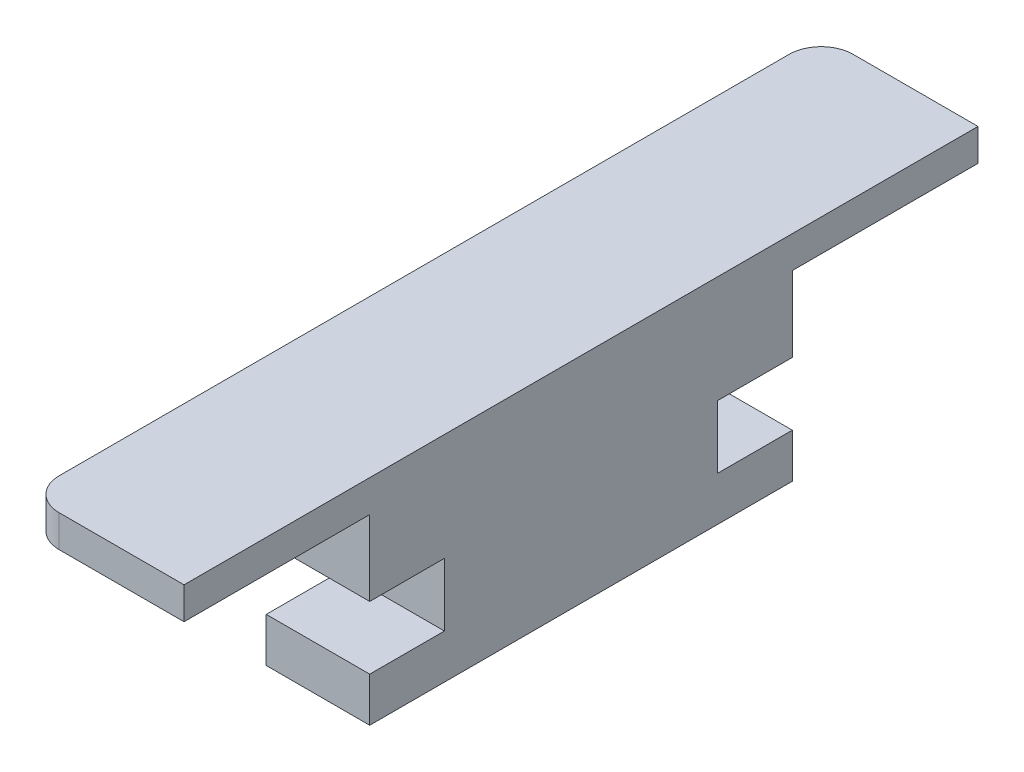
ISO-10303-21;
HEADER;
FILE_DESCRIPTION(('STEP AP214'),'2;1');
FILE_NAME('part.step','',(''),(''),'','','');
FILE_SCHEMA(('AUTOMOTIVE_DESIGN { 1 0 10303 214 1 1 1 1 }'));
ENDSEC;
DATA;
#1=APPLICATION_CONTEXT('core data for automotive mechanical design processes');
#2=APPLICATION_PROTOCOL_DEFINITION('international standard','automotive_design',2000,#1);
#3=PRODUCT_CONTEXT('',#1,'mechanical');
#4=PRODUCT('Part','Part','',(#3));
#5=PRODUCT_RELATED_PRODUCT_CATEGORY('part','',(#4));
#6=PRODUCT_DEFINITION_FORMATION('','',#4);
#7=PRODUCT_DEFINITION_CONTEXT('part definition',#1,'design');
#8=PRODUCT_DEFINITION('design','',#6,#7);
#9=PRODUCT_DEFINITION_SHAPE('','',#8);
#10=(LENGTH_UNIT() NAMED_UNIT(*) SI_UNIT(.MILLI.,.METRE.));
#11=(NAMED_UNIT(*) PLANE_ANGLE_UNIT() SI_UNIT($,.RADIAN.));
#12=(NAMED_UNIT(*) SI_UNIT($,.STERADIAN.) SOLID_ANGLE_UNIT());
#13=UNCERTAINTY_MEASURE_WITH_UNIT(LENGTH_MEASURE(1.E-05),#10,'distance_accuracy_value','');
#14=(GEOMETRIC_REPRESENTATION_CONTEXT(3) GLOBAL_UNCERTAINTY_ASSIGNED_CONTEXT((#13)) GLOBAL_UNIT_ASSIGNED_CONTEXT((#10,
#11,#12)) REPRESENTATION_CONTEXT('',''));
#15=CARTESIAN_POINT('',(0.,0.,0.));
#16=DIRECTION('',(0.,0.,1.));
#17=DIRECTION('',(1.,0.,0.));
#18=AXIS2_PLACEMENT_3D('',#15,#16,#17);
#19=CARTESIAN_POINT('',(10.7056774565792,15.3,0.));
#20=DIRECTION('',(-1.,0.,0.));
#21=DIRECTION('',(0.,0.,1.));
#22=AXIS2_PLACEMENT_3D('',#19,#20,#21);
#23=PLANE('',#22);
#24=DIRECTION('',(0.,0.,1.));
#25=VECTOR('',#24,1.);
#26=CARTESIAN_POINT('',(10.7056774565792,0.200000000000001,0.));
#27=LINE('',#26,#25);
#28=CARTESIAN_POINT('',(10.7056774565792,0.2,-32.884960149613));
#29=VERTEX_POINT('',#28);
#30=CARTESIAN_POINT('',(10.7056774565792,0.2,6.71503985038701));
#31=VERTEX_POINT('',#30);
#32=EDGE_CURVE('E236',#29,#31,#27,.T.);
#33=ORIENTED_EDGE('',*,*,#32,.F.);
#34=DIRECTION('',(0.,-1.,0.));
#35=VECTOR('',#34,1.);
#36=CARTESIAN_POINT('',(10.7056774565792,15.3,-32.884960149613));
#37=LINE('',#36,#35);
#38=CARTESIAN_POINT('',(10.7056774565792,4.35,-32.884960149613));
#39=VERTEX_POINT('',#38);
#40=EDGE_CURVE('E215',#39,#29,#37,.T.);
#41=ORIENTED_EDGE('',*,*,#40,.F.);
#42=DIRECTION('',(0.,0.,-1.));
#43=VECTOR('',#42,1.);
#44=CARTESIAN_POINT('',(10.7056774565792,4.35,-26.169920299226));
#45=LINE('',#44,#43);
#46=CARTESIAN_POINT('',(10.7056774565792,4.35,-25.884960149613));
#47=VERTEX_POINT('',#46);
#48=EDGE_CURVE('E201',#47,#39,#45,.T.);
#49=ORIENTED_EDGE('',*,*,#48,.F.);
#50=DIRECTION('',(0.,-1.,0.));
#51=VECTOR('',#50,1.);
#52=CARTESIAN_POINT('',(10.7056774565792,15.3,-25.884960149613));
#53=LINE('',#52,#51);
#54=CARTESIAN_POINT('',(10.7056774565792,10.25,-25.884960149613));
#55=VERTEX_POINT('',#54);
#56=EDGE_CURVE('E212',#55,#47,#53,.T.);
#57=ORIENTED_EDGE('',*,*,#56,.F.);
#58=DIRECTION('',(0.,0.,1.));
#59=VECTOR('',#58,1.);
#60=CARTESIAN_POINT('',(10.7056774565792,10.25,-26.169920299226));
#61=LINE('',#60,#59);
#62=CARTESIAN_POINT('',(10.7056774565792,10.25,-32.884960149613));
#63=VERTEX_POINT('',#62);
#64=EDGE_CURVE('E209',#63,#55,#61,.T.);
#65=ORIENTED_EDGE('',*,*,#64,.F.);
#66=CARTESIAN_POINT('',(10.7056774565792,17.3,-32.884960149613));
#67=VERTEX_POINT('',#66);
#68=EDGE_CURVE('E216',#67,#63,#37,.T.);
#69=ORIENTED_EDGE('',*,*,#68,.F.);
#70=DIRECTION('',(0.,0.,-1.));
#71=VECTOR('',#70,1.);
#72=CARTESIAN_POINT('',(10.7056774565792,17.3,24.115039850387));
#73=LINE('',#72,#71);
#74=CARTESIAN_POINT('',(10.7056774565792,17.3,-50.284960149613));
#75=VERTEX_POINT('',#74);
#76=EDGE_CURVE('E54',#67,#75,#73,.T.);
#77=ORIENTED_EDGE('',*,*,#76,.T.);
#78=DIRECTION('',(0.,-1.,0.));
#79=VECTOR('',#78,1.);
#80=CARTESIAN_POINT('',(10.7056774565792,0.,-50.284960149613));
#81=LINE('',#80,#79);
#82=CARTESIAN_POINT('',(10.7056774565792,20.3,-50.284960149613));
#83=VERTEX_POINT('',#82);
#84=EDGE_CURVE('E11',#83,#75,#81,.T.);
#85=ORIENTED_EDGE('',*,*,#84,.F.);
#86=DIRECTION('',(0.,0.,1.));
#87=VECTOR('',#86,1.);
#88=CARTESIAN_POINT('',(10.7056774565792,20.3,24.115039850387));
#89=LINE('',#88,#87);
#90=CARTESIAN_POINT('',(10.7056774565792,20.3,24.115039850387));
#91=VERTEX_POINT('',#90);
#92=EDGE_CURVE('E162',#83,#91,#89,.T.);
#93=ORIENTED_EDGE('',*,*,#92,.T.);
#94=DIRECTION('',(0.,1.,0.));
#95=VECTOR('',#94,1.);
#96=CARTESIAN_POINT('',(10.7056774565792,0.,24.115039850387));
#97=LINE('',#96,#95);
#98=CARTESIAN_POINT('',(10.7056774565792,17.3,24.115039850387));
#99=VERTEX_POINT('',#98);
#100=EDGE_CURVE('E305',#99,#91,#97,.T.);
#101=ORIENTED_EDGE('',*,*,#100,.F.);
#102=CARTESIAN_POINT('',(10.7056774565792,17.3,6.71503985038701));
#103=VERTEX_POINT('',#102);
#104=EDGE_CURVE('E307',#99,#103,#73,.T.);
#105=ORIENTED_EDGE('',*,*,#104,.T.);
#106=DIRECTION('',(0.,-1.,0.));
#107=VECTOR('',#106,1.);
#108=CARTESIAN_POINT('',(10.7056774565792,15.3,6.71503985038701));
#109=LINE('',#108,#107);
#110=CARTESIAN_POINT('',(10.7056774565792,10.25,6.71503985038701));
#111=VERTEX_POINT('',#110);
#112=EDGE_CURVE('E280',#103,#111,#109,.T.);
#113=ORIENTED_EDGE('',*,*,#112,.T.);
#114=DIRECTION('',(0.,0.,-1.));
#115=VECTOR('',#114,1.);
#116=CARTESIAN_POINT('',(10.7056774565792,10.25,0.));
#117=LINE('',#116,#115);
#118=CARTESIAN_POINT('',(10.7056774565792,10.25,-0.284960149612992));
#119=VERTEX_POINT('',#118);
#120=EDGE_CURVE('E273',#111,#119,#117,.T.);
#121=ORIENTED_EDGE('',*,*,#120,.T.);
#122=DIRECTION('',(0.,-1.,0.));
#123=VECTOR('',#122,1.);
#124=CARTESIAN_POINT('',(10.7056774565792,15.3,-0.284960149612992));
#125=LINE('',#124,#123);
#126=CARTESIAN_POINT('',(10.7056774565792,4.35,-0.284960149612992));
#127=VERTEX_POINT('',#126);
#128=EDGE_CURVE('E276',#119,#127,#125,.T.);
#129=ORIENTED_EDGE('',*,*,#128,.T.);
#130=DIRECTION('',(0.,0.,1.));
#131=VECTOR('',#130,1.);
#132=CARTESIAN_POINT('',(10.7056774565792,4.35,0.));
#133=LINE('',#132,#131);
#134=CARTESIAN_POINT('',(10.7056774565792,4.35,6.71503985038701));
#135=VERTEX_POINT('',#134);
#136=EDGE_CURVE('E263',#127,#135,#133,.T.);
#137=ORIENTED_EDGE('',*,*,#136,.T.);
#138=EDGE_CURVE('E279',#135,#31,#109,.T.);
#139=ORIENTED_EDGE('',*,*,#138,.T.);
#140=EDGE_LOOP('',(#33,#41,#49,#57,#65,#69,#77,#85,#93,#101,#105,#113,#121,#129,#137,#139));
#141=FACE_BOUND('',#140,.T.);
#142=ADVANCED_FACE('F39',(#141),#23,.F.);
#143=CARTESIAN_POINT('',(1.00567745657921,15.3,0.));
#144=DIRECTION('',(-1.,0.,0.));
#145=DIRECTION('',(0.,0.,1.));
#146=AXIS2_PLACEMENT_3D('',#143,#144,#145);
#147=PLANE('',#146);
#148=DIRECTION('',(0.,0.,1.));
#149=VECTOR('',#148,1.);
#150=CARTESIAN_POINT('',(1.00567745657921,17.3,24.115039850387));
#151=LINE('',#150,#149);
#152=CARTESIAN_POINT('',(1.00567745657921,17.3,-32.884960149613));
#153=VERTEX_POINT('',#152);
#154=CARTESIAN_POINT('',(1.00567745657921,17.3,6.71503985038701));
#155=VERTEX_POINT('',#154);
#156=EDGE_CURVE('E238',#153,#155,#151,.T.);
#157=ORIENTED_EDGE('',*,*,#156,.F.);
#158=DIRECTION('',(0.,-1.,0.));
#159=VECTOR('',#158,1.);
#160=CARTESIAN_POINT('',(1.00567745657921,15.3,-32.884960149613));
#161=LINE('',#160,#159);
#162=CARTESIAN_POINT('',(1.0056774565792,10.25,-32.884960149613));
#163=VERTEX_POINT('',#162);
#164=EDGE_CURVE('E220',#153,#163,#161,.T.);
#165=ORIENTED_EDGE('',*,*,#164,.T.);
#166=DIRECTION('',(0.,0.,-1.));
#167=VECTOR('',#166,1.);
#168=CARTESIAN_POINT('',(1.0056774565792,10.25,-25.884960149613));
#169=LINE('',#168,#167);
#170=CARTESIAN_POINT('',(1.0056774565792,10.25,-25.884960149613));
#171=VERTEX_POINT('',#170);
#172=EDGE_CURVE('E195',#171,#163,#169,.T.);
#173=ORIENTED_EDGE('',*,*,#172,.F.);
#174=DIRECTION('',(0.,1.,0.));
#175=VECTOR('',#174,1.);
#176=CARTESIAN_POINT('',(1.0056774565792,4.35,-25.884960149613));
#177=LINE('',#176,#175);
#178=CARTESIAN_POINT('',(1.0056774565792,4.35,-25.884960149613));
#179=VERTEX_POINT('',#178);
#180=EDGE_CURVE('E192',#179,#171,#177,.T.);
#181=ORIENTED_EDGE('',*,*,#180,.F.);
#182=DIRECTION('',(0.,0.,1.));
#183=VECTOR('',#182,1.);
#184=CARTESIAN_POINT('',(1.0056774565792,4.35,-32.884960149613));
#185=LINE('',#184,#183);
#186=CARTESIAN_POINT('',(1.00567745657921,4.35,-32.884960149613));
#187=VERTEX_POINT('',#186);
#188=EDGE_CURVE('E184',#187,#179,#185,.T.);
#189=ORIENTED_EDGE('',*,*,#188,.F.);
#190=CARTESIAN_POINT('',(1.00567745657921,0.2,-32.884960149613));
#191=VERTEX_POINT('',#190);
#192=EDGE_CURVE('E219',#187,#191,#161,.T.);
#193=ORIENTED_EDGE('',*,*,#192,.T.);
#194=DIRECTION('',(0.,0.,-1.));
#195=VECTOR('',#194,1.);
#196=CARTESIAN_POINT('',(1.00567745657921,0.2,6.71503985038701));
#197=LINE('',#196,#195);
#198=CARTESIAN_POINT('',(1.00567745657921,0.2,6.71503985038701));
#199=VERTEX_POINT('',#198);
#200=EDGE_CURVE('E232',#199,#191,#197,.T.);
#201=ORIENTED_EDGE('',*,*,#200,.F.);
#202=DIRECTION('',(0.,-1.,0.));
#203=VECTOR('',#202,1.);
#204=CARTESIAN_POINT('',(1.00567745657921,15.3,6.71503985038701));
#205=LINE('',#204,#203);
#206=CARTESIAN_POINT('',(1.00567745657921,4.35,6.71503985038701));
#207=VERTEX_POINT('',#206);
#208=EDGE_CURVE('E283',#207,#199,#205,.T.);
#209=ORIENTED_EDGE('',*,*,#208,.F.);
#210=DIRECTION('',(0.,0.,-1.));
#211=VECTOR('',#210,1.);
#212=CARTESIAN_POINT('',(1.0056774565792,4.35,6.71503985038701));
#213=LINE('',#212,#211);
#214=CARTESIAN_POINT('',(1.0056774565792,4.35,-0.284960149612992));
#215=VERTEX_POINT('',#214);
#216=EDGE_CURVE('E250',#207,#215,#213,.T.);
#217=ORIENTED_EDGE('',*,*,#216,.T.);
#218=DIRECTION('',(0.,1.,0.));
#219=VECTOR('',#218,1.);
#220=CARTESIAN_POINT('',(1.0056774565792,4.35,-0.284960149612992));
#221=LINE('',#220,#219);
#222=CARTESIAN_POINT('',(1.0056774565792,10.25,-0.284960149612992));
#223=VERTEX_POINT('',#222);
#224=EDGE_CURVE('E253',#215,#223,#221,.T.);
#225=ORIENTED_EDGE('',*,*,#224,.T.);
#226=DIRECTION('',(0.,0.,1.));
#227=VECTOR('',#226,1.);
#228=CARTESIAN_POINT('',(1.0056774565792,10.25,-0.284960149612992));
#229=LINE('',#228,#227);
#230=CARTESIAN_POINT('',(1.0056774565792,10.25,6.71503985038701));
#231=VERTEX_POINT('',#230);
#232=EDGE_CURVE('E256',#223,#231,#229,.T.);
#233=ORIENTED_EDGE('',*,*,#232,.T.);
#234=EDGE_CURVE('E284',#155,#231,#205,.T.);
#235=ORIENTED_EDGE('',*,*,#234,.F.);
#236=EDGE_LOOP('',(#157,#165,#173,#181,#189,#193,#201,#209,#217,#225,#233,#235));
#237=FACE_BOUND('',#236,.T.);
#238=ADVANCED_FACE('F322',(#237),#147,.T.);
#239=CARTESIAN_POINT('',(0.,15.3,6.71503985038701));
#240=DIRECTION('',(0.,0.,-1.));
#241=DIRECTION('',(-1.,0.,0.));
#242=AXIS2_PLACEMENT_3D('',#239,#240,#241);
#243=PLANE('',#242);
#244=DIRECTION('',(-1.,0.,0.));
#245=VECTOR('',#244,1.);
#246=CARTESIAN_POINT('',(1.00567745657921,0.2,6.71503985038701));
#247=LINE('',#246,#245);
#248=EDGE_CURVE('E234',#31,#199,#247,.T.);
#249=ORIENTED_EDGE('',*,*,#248,.F.);
#250=ORIENTED_EDGE('',*,*,#138,.F.);
#251=DIRECTION('',(1.,0.,0.));
#252=VECTOR('',#251,1.);
#253=CARTESIAN_POINT('',(1.0056774565792,4.35,6.71503985038701));
#254=LINE('',#253,#252);
#255=EDGE_CURVE('E259',#207,#135,#254,.T.);
#256=ORIENTED_EDGE('',*,*,#255,.F.);
#257=ORIENTED_EDGE('',*,*,#208,.T.);
#258=EDGE_LOOP('',(#249,#250,#256,#257));
#259=FACE_BOUND('',#258,.T.);
#260=ADVANCED_FACE('F336',(#259),#243,.F.);
#261=ORIENTED_EDGE('',*,*,#112,.F.);
#262=DIRECTION('',(1.,0.,0.));
#263=VECTOR('',#262,1.);
#264=CARTESIAN_POINT('',(1.00567745657921,17.3,6.71503985038701));
#265=LINE('',#264,#263);
#266=EDGE_CURVE('E247',#155,#103,#265,.T.);
#267=ORIENTED_EDGE('',*,*,#266,.F.);
#268=ORIENTED_EDGE('',*,*,#234,.T.);
#269=DIRECTION('',(1.,0.,0.));
#270=VECTOR('',#269,1.);
#271=CARTESIAN_POINT('',(1.0056774565792,10.25,6.71503985038701));
#272=LINE('',#271,#270);
#273=EDGE_CURVE('E260',#231,#111,#272,.T.);
#274=ORIENTED_EDGE('',*,*,#273,.T.);
#275=EDGE_LOOP('',(#261,#267,#268,#274));
#276=FACE_BOUND('',#275,.T.);
#277=ADVANCED_FACE('F349',(#276),#243,.F.);
#278=CARTESIAN_POINT('',(1.0056774565792,4.35,6.71503985038701));
#279=DIRECTION('',(0.,-1.,0.));
#280=DIRECTION('',(0.,0.,-1.));
#281=AXIS2_PLACEMENT_3D('',#278,#279,#280);
#282=PLANE('',#281);
#283=DIRECTION('',(1.,0.,0.));
#284=VECTOR('',#283,1.);
#285=CARTESIAN_POINT('',(1.0056774565792,4.35,-0.284960149612992));
#286=LINE('',#285,#284);
#287=EDGE_CURVE('E267',#215,#127,#286,.T.);
#288=ORIENTED_EDGE('',*,*,#287,.F.);
#289=ORIENTED_EDGE('',*,*,#216,.F.);
#290=ORIENTED_EDGE('',*,*,#255,.T.);
#291=ORIENTED_EDGE('',*,*,#136,.F.);
#292=EDGE_LOOP('',(#288,#289,#290,#291));
#293=FACE_BOUND('',#292,.T.);
#294=ADVANCED_FACE('F340',(#293),#282,.F.);
#295=CARTESIAN_POINT('',(1.0056774565792,10.25,-0.284960149612992));
#296=DIRECTION('',(0.,1.,0.));
#297=DIRECTION('',(0.,0.,1.));
#298=AXIS2_PLACEMENT_3D('',#295,#296,#297);
#299=PLANE('',#298);
#300=ORIENTED_EDGE('',*,*,#273,.F.);
#301=ORIENTED_EDGE('',*,*,#232,.F.);
#302=DIRECTION('',(1.,0.,0.));
#303=VECTOR('',#302,1.);
#304=CARTESIAN_POINT('',(1.0056774565792,10.25,-0.284960149612992));
#305=LINE('',#304,#303);
#306=EDGE_CURVE('E264',#223,#119,#305,.T.);
#307=ORIENTED_EDGE('',*,*,#306,.T.);
#308=ORIENTED_EDGE('',*,*,#120,.F.);
#309=EDGE_LOOP('',(#300,#301,#307,#308));
#310=FACE_BOUND('',#309,.T.);
#311=ADVANCED_FACE('F345',(#310),#299,.F.);
#312=CARTESIAN_POINT('',(1.0056774565792,4.35,-0.284960149612992));
#313=DIRECTION('',(0.,0.,-1.));
#314=DIRECTION('',(-1.,0.,0.));
#315=AXIS2_PLACEMENT_3D('',#312,#313,#314);
#316=PLANE('',#315);
#317=ORIENTED_EDGE('',*,*,#306,.F.);
#318=ORIENTED_EDGE('',*,*,#224,.F.);
#319=ORIENTED_EDGE('',*,*,#287,.T.);
#320=ORIENTED_EDGE('',*,*,#128,.F.);
#321=EDGE_LOOP('',(#317,#318,#319,#320));
#322=FACE_BOUND('',#321,.T.);
#323=ADVANCED_FACE('F342',(#322),#316,.F.);
#324=CARTESIAN_POINT('',(75.8056774565792,17.3,24.115039850387));
#325=DIRECTION('',(0.,-1.,0.));
#326=DIRECTION('',(0.,0.,-1.));
#327=AXIS2_PLACEMENT_3D('',#324,#325,#326);
#328=PLANE('',#327);
#329=ORIENTED_EDGE('',*,*,#104,.F.);
#330=DIRECTION('',(-1.,0.,0.));
#331=VECTOR('',#330,1.);
#332=CARTESIAN_POINT('',(75.8056774565792,17.3,24.115039850387));
#333=LINE('',#332,#331);
#334=CARTESIAN_POINT('',(-0.994322543420786,17.3,24.115039850387));
#335=VERTEX_POINT('',#334);
#336=EDGE_CURVE('E61',#99,#335,#333,.T.);
#337=ORIENTED_EDGE('',*,*,#336,.T.);
#338=CARTESIAN_POINT('',(-0.994322543420792,17.3,21.115039850387));
#339=DIRECTION('',(0.,-1.,0.));
#340=DIRECTION('',(0.,0.,-1.));
#341=AXIS2_PLACEMENT_3D('',#338,#339,#340);
#342=CIRCLE('',#341,3.);
#343=CARTESIAN_POINT('',(-3.99432254342079,17.3,21.115039850387));
#344=VERTEX_POINT('',#343);
#345=EDGE_CURVE('E47',#335,#344,#342,.T.);
#346=ORIENTED_EDGE('',*,*,#345,.T.);
#347=DIRECTION('',(0.,0.,1.));
#348=VECTOR('',#347,1.);
#349=CARTESIAN_POINT('',(-3.99432254342079,17.3,24.115039850387));
#350=LINE('',#349,#348);
#351=CARTESIAN_POINT('',(-3.99432254342079,17.3,-47.284960149613));
#352=VERTEX_POINT('',#351);
#353=EDGE_CURVE('E241',#352,#344,#350,.T.);
#354=ORIENTED_EDGE('',*,*,#353,.F.);
#355=CARTESIAN_POINT('',(-0.994322543420792,17.3,-47.284960149613));
#356=DIRECTION('',(0.,1.,0.));
#357=DIRECTION('',(0.,0.,1.));
#358=AXIS2_PLACEMENT_3D('',#355,#356,#357);
#359=CIRCLE('',#358,3.);
#360=CARTESIAN_POINT('',(-0.994322543420786,17.3,-50.284960149613));
#361=VERTEX_POINT('',#360);
#362=EDGE_CURVE('E229',#361,#352,#359,.T.);
#363=ORIENTED_EDGE('',*,*,#362,.F.);
#364=DIRECTION('',(-1.,0.,0.));
#365=VECTOR('',#364,1.);
#366=CARTESIAN_POINT('',(75.8056774565792,17.3,-50.284960149613));
#367=LINE('',#366,#365);
#368=EDGE_CURVE('E181',#75,#361,#367,.T.);
#369=ORIENTED_EDGE('',*,*,#368,.F.);
#370=ORIENTED_EDGE('',*,*,#76,.F.);
#371=DIRECTION('',(1.,0.,0.));
#372=VECTOR('',#371,1.);
#373=CARTESIAN_POINT('',(1.00567745657921,17.3,-32.884960149613));
#374=LINE('',#373,#372);
#375=EDGE_CURVE('E180',#153,#67,#374,.T.);
#376=ORIENTED_EDGE('',*,*,#375,.F.);
#377=ORIENTED_EDGE('',*,*,#156,.T.);
#378=ORIENTED_EDGE('',*,*,#266,.T.);
#379=EDGE_LOOP('',(#329,#337,#346,#354,#363,#369,#370,#376,#377,#378));
#380=FACE_BOUND('',#379,.T.);
#381=ADVANCED_FACE('F294',(#380),#328,.T.);
#382=CARTESIAN_POINT('',(1.00567745657921,20.3,24.115039850387));
#383=DIRECTION('',(0.,1.,0.));
#384=DIRECTION('',(-1.,0.,0.));
#385=AXIS2_PLACEMENT_3D('',#382,#383,#384);
#386=PLANE('',#385);
#387=ORIENTED_EDGE('',*,*,#92,.F.);
#388=DIRECTION('',(1.,0.,0.));
#389=VECTOR('',#388,1.);
#390=CARTESIAN_POINT('',(1.00567745657921,20.3,-50.284960149613));
#391=LINE('',#390,#389);
#392=CARTESIAN_POINT('',(-0.994322543420792,20.3,-50.284960149613));
#393=VERTEX_POINT('',#392);
#394=EDGE_CURVE('E172',#393,#83,#391,.T.);
#395=ORIENTED_EDGE('',*,*,#394,.F.);
#396=CARTESIAN_POINT('',(-0.994322543420792,20.3,-47.284960149613));
#397=DIRECTION('',(0.,-1.,0.));
#398=DIRECTION('',(-1.,0.,0.));
#399=AXIS2_PLACEMENT_3D('',#396,#397,#398);
#400=CIRCLE('',#399,3.);
#401=CARTESIAN_POINT('',(-3.99432254342079,20.3,-47.284960149613));
#402=VERTEX_POINT('',#401);
#403=EDGE_CURVE('E226',#402,#393,#400,.T.);
#404=ORIENTED_EDGE('',*,*,#403,.F.);
#405=DIRECTION('',(0.,0.,-1.));
#406=VECTOR('',#405,1.);
#407=CARTESIAN_POINT('',(-3.99432254342079,20.3,24.115039850387));
#408=LINE('',#407,#406);
#409=CARTESIAN_POINT('',(-3.99432254342079,20.3,21.115039850387));
#410=VERTEX_POINT('',#409);
#411=EDGE_CURVE('E239',#410,#402,#408,.T.);
#412=ORIENTED_EDGE('',*,*,#411,.F.);
#413=CARTESIAN_POINT('',(-0.994322543420792,20.3,21.115039850387));
#414=DIRECTION('',(0.,1.,0.));
#415=DIRECTION('',(-1.,0.,0.));
#416=AXIS2_PLACEMENT_3D('',#413,#414,#415);
#417=CIRCLE('',#416,3.);
#418=CARTESIAN_POINT('',(-0.994322543420792,20.3,24.115039850387));
#419=VERTEX_POINT('',#418);
#420=EDGE_CURVE('E290',#410,#419,#417,.T.);
#421=ORIENTED_EDGE('',*,*,#420,.T.);
#422=DIRECTION('',(1.,0.,0.));
#423=VECTOR('',#422,1.);
#424=CARTESIAN_POINT('',(1.00567745657921,20.3,24.115039850387));
#425=LINE('',#424,#423);
#426=EDGE_CURVE('E174',#419,#91,#425,.T.);
#427=ORIENTED_EDGE('',*,*,#426,.T.);
#428=EDGE_LOOP('',(#387,#395,#404,#412,#421,#427));
#429=FACE_BOUND('',#428,.T.);
#430=ADVANCED_FACE('F170',(#429),#386,.T.);
#431=CARTESIAN_POINT('',(0.,0.,24.115039850387));
#432=DIRECTION('',(0.,0.,-1.));
#433=DIRECTION('',(-1.,0.,0.));
#434=AXIS2_PLACEMENT_3D('',#431,#432,#433);
#435=PLANE('',#434);
#436=ORIENTED_EDGE('',*,*,#336,.F.);
#437=ORIENTED_EDGE('',*,*,#100,.T.);
#438=ORIENTED_EDGE('',*,*,#426,.F.);
#439=DIRECTION('',(0.,1.,0.));
#440=VECTOR('',#439,1.);
#441=CARTESIAN_POINT('',(-0.994322543420792,17.3,24.115039850387));
#442=LINE('',#441,#440);
#443=EDGE_CURVE('E292',#419,#335,#442,.F.);
#444=ORIENTED_EDGE('',*,*,#443,.T.);
#445=EDGE_LOOP('',(#436,#437,#438,#444));
#446=FACE_BOUND('',#445,.T.);
#447=ADVANCED_FACE('F304',(#446),#435,.F.);
#448=CARTESIAN_POINT('',(-3.99432254342079,0.,0.));
#449=DIRECTION('',(-1.,0.,0.));
#450=DIRECTION('',(0.,0.,1.));
#451=AXIS2_PLACEMENT_3D('',#448,#449,#450);
#452=PLANE('',#451);
#453=ORIENTED_EDGE('',*,*,#353,.T.);
#454=DIRECTION('',(0.,1.,0.));
#455=VECTOR('',#454,1.);
#456=CARTESIAN_POINT('',(-3.99432254342079,20.3,21.115039850387));
#457=LINE('',#456,#455);
#458=EDGE_CURVE('E287',#344,#410,#457,.T.);
#459=ORIENTED_EDGE('',*,*,#458,.T.);
#460=ORIENTED_EDGE('',*,*,#411,.T.);
#461=DIRECTION('',(0.,1.,0.));
#462=VECTOR('',#461,1.);
#463=CARTESIAN_POINT('',(-3.99432254342079,20.3,-47.284960149613));
#464=LINE('',#463,#462);
#465=EDGE_CURVE('E223',#352,#402,#464,.T.);
#466=ORIENTED_EDGE('',*,*,#465,.F.);
#467=EDGE_LOOP('',(#453,#459,#460,#466));
#468=FACE_BOUND('',#467,.T.);
#469=ADVANCED_FACE('F301',(#468),#452,.T.);
#470=CARTESIAN_POINT('',(-0.994322543420792,0.,21.115039850387));
#471=DIRECTION('',(0.,-1.,0.));
#472=DIRECTION('',(0.,0.,-1.));
#473=AXIS2_PLACEMENT_3D('',#470,#471,#472);
#474=CYLINDRICAL_SURFACE('',#473,3.);
#475=ORIENTED_EDGE('',*,*,#345,.F.);
#476=ORIENTED_EDGE('',*,*,#443,.F.);
#477=ORIENTED_EDGE('',*,*,#420,.F.);
#478=ORIENTED_EDGE('',*,*,#458,.F.);
#479=EDGE_LOOP('',(#475,#476,#477,#478));
#480=FACE_BOUND('',#479,.T.);
#481=ADVANCED_FACE('F41',(#480),#474,.T.);
#482=CARTESIAN_POINT('',(0.,0.2,0.));
#483=DIRECTION('',(0.,-1.,0.));
#484=DIRECTION('',(0.,0.,-1.));
#485=AXIS2_PLACEMENT_3D('',#482,#483,#484);
#486=PLANE('',#485);
#487=DIRECTION('',(-1.,0.,0.));
#488=VECTOR('',#487,1.);
#489=CARTESIAN_POINT('',(1.00567745657921,0.2,-32.884960149613));
#490=LINE('',#489,#488);
#491=EDGE_CURVE('E186',#29,#191,#490,.T.);
#492=ORIENTED_EDGE('',*,*,#491,.F.);
#493=ORIENTED_EDGE('',*,*,#32,.T.);
#494=ORIENTED_EDGE('',*,*,#248,.T.);
#495=ORIENTED_EDGE('',*,*,#200,.T.);
#496=EDGE_LOOP('',(#492,#493,#494,#495));
#497=FACE_BOUND('',#496,.T.);
#498=ADVANCED_FACE('F334',(#497),#486,.T.);
#499=CARTESIAN_POINT('',(0.,15.3,-32.884960149613));
#500=DIRECTION('',(0.,0.,1.));
#501=DIRECTION('',(-1.,0.,0.));
#502=AXIS2_PLACEMENT_3D('',#499,#500,#501);
#503=PLANE('',#502);
#504=ORIENTED_EDGE('',*,*,#491,.T.);
#505=ORIENTED_EDGE('',*,*,#192,.F.);
#506=DIRECTION('',(1.,0.,0.));
#507=VECTOR('',#506,1.);
#508=CARTESIAN_POINT('',(1.0056774565792,4.35,-32.884960149613));
#509=LINE('',#508,#507);
#510=EDGE_CURVE('E198',#187,#39,#509,.T.);
#511=ORIENTED_EDGE('',*,*,#510,.T.);
#512=ORIENTED_EDGE('',*,*,#40,.T.);
#513=EDGE_LOOP('',(#504,#505,#511,#512));
#514=FACE_BOUND('',#513,.T.);
#515=ADVANCED_FACE('F316',(#514),#503,.F.);
#516=ORIENTED_EDGE('',*,*,#375,.T.);
#517=ORIENTED_EDGE('',*,*,#68,.T.);
#518=DIRECTION('',(1.,0.,0.));
#519=VECTOR('',#518,1.);
#520=CARTESIAN_POINT('',(1.0056774565792,10.25,-32.884960149613));
#521=LINE('',#520,#519);
#522=EDGE_CURVE('E199',#163,#63,#521,.T.);
#523=ORIENTED_EDGE('',*,*,#522,.F.);
#524=ORIENTED_EDGE('',*,*,#164,.F.);
#525=EDGE_LOOP('',(#516,#517,#523,#524));
#526=FACE_BOUND('',#525,.T.);
#527=ADVANCED_FACE('F353',(#526),#503,.F.);
#528=CARTESIAN_POINT('',(1.0056774565792,4.35,-32.884960149613));
#529=DIRECTION('',(0.,-1.,0.));
#530=DIRECTION('',(0.,0.,1.));
#531=AXIS2_PLACEMENT_3D('',#528,#529,#530);
#532=PLANE('',#531);
#533=DIRECTION('',(1.,0.,0.));
#534=VECTOR('',#533,1.);
#535=CARTESIAN_POINT('',(1.0056774565792,4.35,-25.884960149613));
#536=LINE('',#535,#534);
#537=EDGE_CURVE('E204',#179,#47,#536,.T.);
#538=ORIENTED_EDGE('',*,*,#537,.T.);
#539=ORIENTED_EDGE('',*,*,#48,.T.);
#540=ORIENTED_EDGE('',*,*,#510,.F.);
#541=ORIENTED_EDGE('',*,*,#188,.T.);
#542=EDGE_LOOP('',(#538,#539,#540,#541));
#543=FACE_BOUND('',#542,.T.);
#544=ADVANCED_FACE('F328',(#543),#532,.F.);
#545=CARTESIAN_POINT('',(1.0056774565792,10.25,-25.884960149613));
#546=DIRECTION('',(0.,1.,0.));
#547=DIRECTION('',(0.,0.,-1.));
#548=AXIS2_PLACEMENT_3D('',#545,#546,#547);
#549=PLANE('',#548);
#550=ORIENTED_EDGE('',*,*,#522,.T.);
#551=ORIENTED_EDGE('',*,*,#64,.T.);
#552=DIRECTION('',(1.,0.,0.));
#553=VECTOR('',#552,1.);
#554=CARTESIAN_POINT('',(1.0056774565792,10.25,-25.884960149613));
#555=LINE('',#554,#553);
#556=EDGE_CURVE('E202',#171,#55,#555,.T.);
#557=ORIENTED_EDGE('',*,*,#556,.F.);
#558=ORIENTED_EDGE('',*,*,#172,.T.);
#559=EDGE_LOOP('',(#550,#551,#557,#558));
#560=FACE_BOUND('',#559,.T.);
#561=ADVANCED_FACE('F356',(#560),#549,.F.);
#562=CARTESIAN_POINT('',(1.0056774565792,4.35,-25.884960149613));
#563=DIRECTION('',(0.,0.,1.));
#564=DIRECTION('',(-1.,0.,0.));
#565=AXIS2_PLACEMENT_3D('',#562,#563,#564);
#566=PLANE('',#565);
#567=ORIENTED_EDGE('',*,*,#556,.T.);
#568=ORIENTED_EDGE('',*,*,#56,.T.);
#569=ORIENTED_EDGE('',*,*,#537,.F.);
#570=ORIENTED_EDGE('',*,*,#180,.T.);
#571=EDGE_LOOP('',(#567,#568,#569,#570));
#572=FACE_BOUND('',#571,.T.);
#573=ADVANCED_FACE('F358',(#572),#566,.F.);
#574=CARTESIAN_POINT('',(0.,0.,-50.284960149613));
#575=DIRECTION('',(0.,0.,1.));
#576=DIRECTION('',(-1.,0.,0.));
#577=AXIS2_PLACEMENT_3D('',#574,#575,#576);
#578=PLANE('',#577);
#579=ORIENTED_EDGE('',*,*,#394,.T.);
#580=ORIENTED_EDGE('',*,*,#84,.T.);
#581=ORIENTED_EDGE('',*,*,#368,.T.);
#582=DIRECTION('',(0.,1.,0.));
#583=VECTOR('',#582,1.);
#584=CARTESIAN_POINT('',(-0.994322543420792,17.3,-50.284960149613));
#585=LINE('',#584,#583);
#586=EDGE_CURVE('E178',#393,#361,#585,.F.);
#587=ORIENTED_EDGE('',*,*,#586,.F.);
#588=EDGE_LOOP('',(#579,#580,#581,#587));
#589=FACE_BOUND('',#588,.T.);
#590=ADVANCED_FACE('F176',(#589),#578,.F.);
#591=CARTESIAN_POINT('',(-0.994322543420792,0.,-47.284960149613));
#592=DIRECTION('',(0.,-1.,0.));
#593=DIRECTION('',(0.,0.,1.));
#594=AXIS2_PLACEMENT_3D('',#591,#592,#593);
#595=CYLINDRICAL_SURFACE('',#594,3.);
#596=ORIENTED_EDGE('',*,*,#362,.T.);
#597=ORIENTED_EDGE('',*,*,#465,.T.);
#598=ORIENTED_EDGE('',*,*,#403,.T.);
#599=ORIENTED_EDGE('',*,*,#586,.T.);
#600=EDGE_LOOP('',(#596,#597,#598,#599));
#601=FACE_BOUND('',#600,.T.);
#602=ADVANCED_FACE('F360',(#601),#595,.T.);
#603=CLOSED_SHELL('',(#142,#238,#260,#277,#294,#311,#323,#381,#430,#447,#469,#481,#498,#515,
#527,#544,#561,#573,#590,#602));
#604=MANIFOLD_SOLID_BREP('B2',#603);
#605=ADVANCED_BREP_SHAPE_REPRESENTATION('',(#18,#604),#14);
#606=SHAPE_DEFINITION_REPRESENTATION(#9,#605);
ENDSEC;
END-ISO-10303-21;
